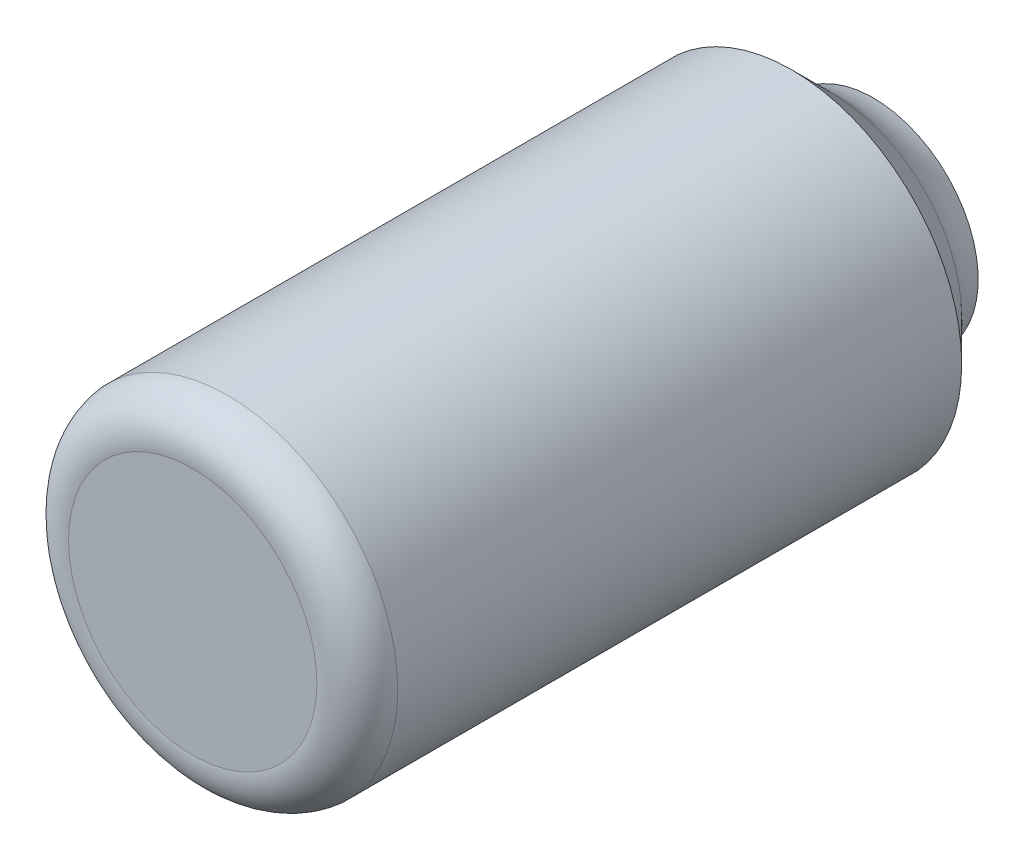
ISO-10303-21;
HEADER;
FILE_DESCRIPTION(('STEP AP214'),'2;1');
FILE_NAME('part.step','',(''),(''),'','','');
FILE_SCHEMA(('AUTOMOTIVE_DESIGN { 1 0 10303 214 1 1 1 1 }'));
ENDSEC;
DATA;
#1=APPLICATION_CONTEXT('core data for automotive mechanical design processes');
#2=APPLICATION_PROTOCOL_DEFINITION('international standard','automotive_design',2000,#1);
#3=PRODUCT_CONTEXT('',#1,'mechanical');
#4=PRODUCT('Part','Part','',(#3));
#5=PRODUCT_RELATED_PRODUCT_CATEGORY('part','',(#4));
#6=PRODUCT_DEFINITION_FORMATION('','',#4);
#7=PRODUCT_DEFINITION_CONTEXT('part definition',#1,'design');
#8=PRODUCT_DEFINITION('design','',#6,#7);
#9=PRODUCT_DEFINITION_SHAPE('','',#8);
#10=(LENGTH_UNIT() NAMED_UNIT(*) SI_UNIT(.MILLI.,.METRE.));
#11=(NAMED_UNIT(*) PLANE_ANGLE_UNIT() SI_UNIT($,.RADIAN.));
#12=(NAMED_UNIT(*) SI_UNIT($,.STERADIAN.) SOLID_ANGLE_UNIT());
#13=UNCERTAINTY_MEASURE_WITH_UNIT(LENGTH_MEASURE(1.E-05),#10,'distance_accuracy_value','');
#14=(GEOMETRIC_REPRESENTATION_CONTEXT(3) GLOBAL_UNCERTAINTY_ASSIGNED_CONTEXT((#13)) GLOBAL_UNIT_ASSIGNED_CONTEXT((#10,
#11,#12)) REPRESENTATION_CONTEXT('',''));
#15=CARTESIAN_POINT('',(0.,0.,0.));
#16=DIRECTION('',(0.,0.,1.));
#17=DIRECTION('',(1.,0.,0.));
#18=AXIS2_PLACEMENT_3D('',#15,#16,#17);
#19=CARTESIAN_POINT('',(47.8355133380434,0.,-140.449159359589));
#20=DIRECTION('',(0.,0.,-1.));
#21=DIRECTION('',(-1.,0.,0.));
#22=AXIS2_PLACEMENT_3D('',#19,#20,#21);
#23=PLANE('',#22);
#24=CARTESIAN_POINT('',(47.8355133380434,0.,-140.449159359589));
#25=DIRECTION('',(0.,0.,-1.));
#26=DIRECTION('',(-1.,0.,0.));
#27=AXIS2_PLACEMENT_3D('',#24,#25,#26);
#28=CIRCLE('',#27,9.6066359257185);
#29=CARTESIAN_POINT('',(38.2288774123249,0.,-140.449159359589));
#30=VERTEX_POINT('',#29);
#31=EDGE_CURVE('E11',#30,#30,#28,.T.);
#32=ORIENTED_EDGE('',*,*,#31,.T.);
#33=EDGE_LOOP('',(#32));
#34=FACE_BOUND('',#33,.T.);
#35=DIRECTION('',(-0.970041850088927,0.242937870814848,0.));
#36=VECTOR('',#35,1.);
#37=CARTESIAN_POINT('',(51.7545287333468,-2.70339492537794,-140.449159359589));
#38=LINE('',#37,#36);
#39=CARTESIAN_POINT('',(52.3415378287659,-2.8504058401926,-140.449159359589));
#40=VERTEX_POINT('',#39);
#41=CARTESIAN_POINT('',(51.7545287333468,-2.70339492537794,-140.449159359589));
#42=VERTEX_POINT('',#41);
#43=EDGE_CURVE('E194',#40,#42,#38,.T.);
#44=ORIENTED_EDGE('',*,*,#43,.F.);
#45=DIRECTION('',(-0.94175387951254,-0.336302884946117,0.));
#46=VECTOR('',#45,1.);
#47=CARTESIAN_POINT('',(52.3415378287659,-2.8504058401926,-140.449159359589));
#48=LINE('',#47,#46);
#49=CARTESIAN_POINT('',(53.2448602592391,-2.52782693076256,-140.449159359589));
#50=VERTEX_POINT('',#49);
#51=EDGE_CURVE('E191',#50,#40,#48,.T.);
#52=ORIENTED_EDGE('',*,*,#51,.F.);
#53=DIRECTION('',(-0.456709986704067,-0.88961564062508,0.));
#54=VECTOR('',#53,1.);
#55=CARTESIAN_POINT('',(53.2448602592391,-2.52782693076256,-140.449159359589));
#56=LINE('',#55,#54);
#57=CARTESIAN_POINT('',(53.9306708570305,-1.19195109694366,-140.449159359589));
#58=VERTEX_POINT('',#57);
#59=EDGE_CURVE('E114',#58,#50,#56,.T.);
#60=ORIENTED_EDGE('',*,*,#59,.F.);
#61=DIRECTION('',(0.,-1.,0.));
#62=VECTOR('',#61,1.);
#63=CARTESIAN_POINT('',(53.9306708570305,-1.19195109694366,-140.449159359589));
#64=LINE('',#63,#62);
#65=CARTESIAN_POINT('',(53.9306708570305,0.,-140.449159359589));
#66=VERTEX_POINT('',#65);
#67=EDGE_CURVE('E224',#66,#58,#64,.T.);
#68=ORIENTED_EDGE('',*,*,#67,.F.);
#69=DIRECTION('',(0.475631900034391,-0.879644414334381,0.));
#70=VECTOR('',#69,1.);
#71=CARTESIAN_POINT('',(53.9306708570305,0.,-140.449159359589));
#72=LINE('',#71,#70);
#73=CARTESIAN_POINT('',(53.3971273301414,0.986747489389014,-140.449159359589));
#74=VERTEX_POINT('',#73);
#75=EDGE_CURVE('E180',#74,#66,#72,.T.);
#76=ORIENTED_EDGE('',*,*,#75,.F.);
#77=DIRECTION('',(1.,0.,0.));
#78=VECTOR('',#77,1.);
#79=CARTESIAN_POINT('',(53.3971273301414,0.986747489389014,-140.449159359589));
#80=LINE('',#79,#78);
#81=CARTESIAN_POINT('',(52.0041654403258,0.986747489389014,-140.449159359589));
#82=VERTEX_POINT('',#81);
#83=EDGE_CURVE('E221',#82,#74,#80,.T.);
#84=ORIENTED_EDGE('',*,*,#83,.F.);
#85=DIRECTION('',(0.994351366702763,-0.106138398029874,0.));
#86=VECTOR('',#85,1.);
#87=CARTESIAN_POINT('',(52.0041654403258,0.986747489389014,-140.449159359589));
#88=LINE('',#87,#86);
#89=CARTESIAN_POINT('',(51.0285729615471,1.09088353857143,-140.449159359589));
#90=VERTEX_POINT('',#89);
#91=EDGE_CURVE('E219',#90,#82,#88,.T.);
#92=ORIENTED_EDGE('',*,*,#91,.F.);
#93=DIRECTION('',(1.,0.,0.));
#94=VECTOR('',#93,1.);
#95=CARTESIAN_POINT('',(51.0285729615471,1.09088353857143,-140.449159359589));
#96=LINE('',#95,#94);
#97=CARTESIAN_POINT('',(48.9586917903262,1.09088353857142,-140.449159359589));
#98=VERTEX_POINT('',#97);
#99=EDGE_CURVE('E217',#98,#90,#96,.T.);
#100=ORIENTED_EDGE('',*,*,#99,.F.);
#101=DIRECTION('',(0.475631900034341,-0.879644414334408,0.));
#102=VECTOR('',#101,1.);
#103=CARTESIAN_POINT('',(48.9586917903262,1.09088353857142,-140.449159359589));
#104=LINE('',#103,#102);
#105=CARTESIAN_POINT('',(48.8720461133404,1.25112801708793,-140.449159359589));
#106=VERTEX_POINT('',#105);
#107=EDGE_CURVE('E215',#106,#98,#104,.T.);
#108=ORIENTED_EDGE('',*,*,#107,.F.);
#109=DIRECTION('',(1.,0.,0.));
#110=VECTOR('',#109,1.);
#111=CARTESIAN_POINT('',(48.8720461133404,1.25112801708793,-140.449159359589));
#112=LINE('',#111,#110);
#113=CARTESIAN_POINT('',(47.8198321558652,1.25112801708791,-140.449159359589));
#114=VERTEX_POINT('',#113);
#115=EDGE_CURVE('E213',#114,#106,#112,.T.);
#116=ORIENTED_EDGE('',*,*,#115,.F.);
#117=DIRECTION('',(0.879644414334501,0.475631900034167,0.));
#118=VECTOR('',#117,1.);
#119=CARTESIAN_POINT('',(47.8198321558652,1.25112801708791,-140.449159359589));
#120=LINE('',#119,#118);
#121=CARTESIAN_POINT('',(47.7468753933748,1.21167961839615,-140.449159359589));
#122=VERTEX_POINT('',#121);
#123=EDGE_CURVE('E211',#122,#114,#120,.T.);
#124=ORIENTED_EDGE('',*,*,#123,.F.);
#125=DIRECTION('',(0.456709986704065,0.889615640625081,0.));
#126=VECTOR('',#125,1.);
#127=CARTESIAN_POINT('',(47.7468753933748,1.21167961839615,-140.449159359589));
#128=LINE('',#127,#126);
#129=CARTESIAN_POINT('',(47.3737815134735,0.484938008524661,-140.449159359589));
#130=VERTEX_POINT('',#129);
#131=EDGE_CURVE('E209',#130,#122,#128,.T.);
#132=ORIENTED_EDGE('',*,*,#131,.F.);
#133=DIRECTION('',(0.242937870814847,0.970041850088927,0.));
#134=VECTOR('',#133,1.);
#135=CARTESIAN_POINT('',(47.3737815134735,0.484938008524661,-140.449159359589));
#136=LINE('',#135,#134);
#137=CARTESIAN_POINT('',(47.166149856795,-0.344127446383171,-140.449159359589));
#138=VERTEX_POINT('',#137);
#139=EDGE_CURVE('E207',#138,#130,#136,.T.);
#140=ORIENTED_EDGE('',*,*,#139,.F.);
#141=DIRECTION('',(0.,1.,0.));
#142=VECTOR('',#141,1.);
#143=CARTESIAN_POINT('',(47.166149856795,-0.344127446383171,-140.449159359589));
#144=LINE('',#143,#142);
#145=CARTESIAN_POINT('',(47.166149856795,-1.08716801066841,-140.449159359589));
#146=VERTEX_POINT('',#145);
#147=EDGE_CURVE('E205',#146,#138,#144,.T.);
#148=ORIENTED_EDGE('',*,*,#147,.F.);
#149=DIRECTION('',(-0.475631900034389,0.879644414334381,0.));
#150=VECTOR('',#149,1.);
#151=CARTESIAN_POINT('',(47.166149856795,-1.08716801066841,-140.449159359589));
#152=LINE('',#151,#150);
#153=CARTESIAN_POINT('',(47.94512750765,-2.52782693076256,-140.449159359589));
#154=VERTEX_POINT('',#153);
#155=EDGE_CURVE('E203',#154,#146,#152,.T.);
#156=ORIENTED_EDGE('',*,*,#155,.F.);
#157=DIRECTION('',(-1.,0.,0.));
#158=VECTOR('',#157,1.);
#159=CARTESIAN_POINT('',(47.94512750765,-2.52782693076256,-140.449159359589));
#160=LINE('',#159,#158);
#161=CARTESIAN_POINT('',(49.9755772487313,-2.52782693076256,-140.449159359589));
#162=VERTEX_POINT('',#161);
#163=EDGE_CURVE('E201',#162,#154,#160,.T.);
#164=ORIENTED_EDGE('',*,*,#163,.F.);
#165=DIRECTION('',(-0.970041850088927,0.242937870814847,0.));
#166=VECTOR('',#165,1.);
#167=CARTESIAN_POINT('',(49.9755772487313,-2.52782693076256,-140.449159359589));
#168=LINE('',#167,#166);
#169=CARTESIAN_POINT('',(50.6766136978525,-2.70339492537794,-140.449159359589));
#170=VERTEX_POINT('',#169);
#171=EDGE_CURVE('E199',#170,#162,#168,.T.);
#172=ORIENTED_EDGE('',*,*,#171,.F.);
#173=DIRECTION('',(-1.,0.,0.));
#174=VECTOR('',#173,1.);
#175=CARTESIAN_POINT('',(50.6766136978525,-2.70339492537794,-140.449159359589));
#176=LINE('',#175,#174);
#177=EDGE_CURVE('E197',#42,#170,#176,.T.);
#178=ORIENTED_EDGE('',*,*,#177,.F.);
#179=EDGE_LOOP('',(#44,#52,#60,#68,#76,#84,#92,#100,#108,#116,#124,#132,#140,#148,#156,#164,
#172,#178));
#180=FACE_BOUND('',#179,.T.);
#181=ADVANCED_FACE('F35',(#34,#180),#23,.T.);
#182=CARTESIAN_POINT('',(47.8355133380434,0.,-141.449159359589));
#183=DIRECTION('',(0.,0.,-1.));
#184=DIRECTION('',(-1.,0.,0.));
#185=AXIS2_PLACEMENT_3D('',#182,#183,#184);
#186=PLANE('',#185);
#187=CARTESIAN_POINT('',(47.8355133380434,0.,-141.449159359589));
#188=DIRECTION('',(0.,0.,-1.));
#189=DIRECTION('',(-1.,0.,0.));
#190=AXIS2_PLACEMENT_3D('',#187,#188,#189);
#191=CIRCLE('',#190,10.6066359257185);
#192=CARTESIAN_POINT('',(37.2288774123249,0.,-141.449159359589));
#193=VERTEX_POINT('',#192);
#194=EDGE_CURVE('E272',#193,#193,#191,.T.);
#195=ORIENTED_EDGE('',*,*,#194,.F.);
#196=EDGE_LOOP('',(#195));
#197=FACE_BOUND('',#196,.T.);
#198=CARTESIAN_POINT('',(47.8355133380434,0.,-141.449159359589));
#199=DIRECTION('',(0.,0.,-1.));
#200=DIRECTION('',(-1.,0.,0.));
#201=AXIS2_PLACEMENT_3D('',#198,#199,#200);
#202=CIRCLE('',#201,11.1551524124221);
#203=CARTESIAN_POINT('',(36.6803609256212,0.,-141.449159359589));
#204=VERTEX_POINT('',#203);
#205=EDGE_CURVE('E284',#204,#204,#202,.T.);
#206=ORIENTED_EDGE('',*,*,#205,.T.);
#207=EDGE_LOOP('',(#206));
#208=FACE_BOUND('',#207,.T.);
#209=ADVANCED_FACE('F298',(#197,#208),#186,.T.);
#210=CARTESIAN_POINT('',(47.8355133380434,0.,-139.695253366882));
#211=DIRECTION('',(0.,0.,1.));
#212=DIRECTION('',(1.,0.,0.));
#213=AXIS2_PLACEMENT_3D('',#210,#211,#212);
#214=CONICAL_SURFACE('',#213,11.1551524124221,0.78539816339744);
#215=CARTESIAN_POINT('',(47.8355133380434,0.,-137.161496517432));
#216=DIRECTION('',(0.,0.,1.));
#217=DIRECTION('',(1.,0.,0.));
#218=AXIS2_PLACEMENT_3D('',#215,#216,#217);
#219=CIRCLE('',#218,13.6889092618714);
#220=CARTESIAN_POINT('',(61.5244225999147,0.,-137.161496517432));
#221=VERTEX_POINT('',#220);
#222=EDGE_CURVE('E43',#221,#221,#219,.T.);
#223=ORIENTED_EDGE('',*,*,#222,.T.);
#224=EDGE_LOOP('',(#223));
#225=FACE_BOUND('',#224,.T.);
#226=CARTESIAN_POINT('',(47.8355133380434,0.,-132.769496790582));
#227=DIRECTION('',(0.,0.,-1.));
#228=DIRECTION('',(-1.,0.,0.));
#229=AXIS2_PLACEMENT_3D('',#226,#227,#228);
#230=CIRCLE('',#229,18.0809089887216);
#231=CARTESIAN_POINT('',(29.7546043493217,0.,-132.769496790582));
#232=VERTEX_POINT('',#231);
#233=EDGE_CURVE('E281',#232,#232,#230,.T.);
#234=ORIENTED_EDGE('',*,*,#233,.T.);
#235=EDGE_LOOP('',(#234));
#236=FACE_BOUND('',#235,.T.);
#237=ADVANCED_FACE('F289',(#225,#236),#214,.T.);
#238=CARTESIAN_POINT('',(47.8355133380434,0.,-141.449159359589));
#239=DIRECTION('',(0.,0.,-1.));
#240=DIRECTION('',(-1.,0.,0.));
#241=AXIS2_PLACEMENT_3D('',#238,#239,#240);
#242=CYLINDRICAL_SURFACE('',#241,18.0809089887216);
#243=CARTESIAN_POINT('',(47.8355133380434,0.,-72.7686964143737));
#244=DIRECTION('',(0.,0.,-1.));
#245=DIRECTION('',(-1.,0.,0.));
#246=AXIS2_PLACEMENT_3D('',#243,#244,#245);
#247=CIRCLE('',#246,18.0809089887216);
#248=CARTESIAN_POINT('',(29.7546043493217,0.,-72.7686964143737));
#249=VERTEX_POINT('',#248);
#250=EDGE_CURVE('E278',#249,#249,#247,.T.);
#251=ORIENTED_EDGE('',*,*,#250,.T.);
#252=EDGE_LOOP('',(#251));
#253=FACE_BOUND('',#252,.T.);
#254=ORIENTED_EDGE('',*,*,#233,.F.);
#255=EDGE_LOOP('',(#254));
#256=FACE_BOUND('',#255,.T.);
#257=ADVANCED_FACE('F306',(#253,#256),#242,.T.);
#258=CARTESIAN_POINT('',(47.8355133380434,0.,-73.3364639487153));
#259=DIRECTION('',(0.,0.,-1.));
#260=DIRECTION('',(-1.,0.,0.));
#261=AXIS2_PLACEMENT_3D('',#258,#259,#260);
#262=TOROIDAL_SURFACE('',#261,13.7791053245254,4.3391099016209);
#263=CARTESIAN_POINT('',(47.8355133380434,0.,-69.034660284519));
#264=DIRECTION('',(0.,0.,-1.));
#265=DIRECTION('',(-1.,0.,0.));
#266=AXIS2_PLACEMENT_3D('',#263,#264,#265);
#267=CIRCLE('',#266,13.2113377901839);
#268=CARTESIAN_POINT('',(34.6241755478595,0.,-69.034660284519));
#269=VERTEX_POINT('',#268);
#270=EDGE_CURVE('E275',#269,#269,#267,.T.);
#271=ORIENTED_EDGE('',*,*,#270,.T.);
#272=EDGE_LOOP('',(#271));
#273=FACE_BOUND('',#272,.T.);
#274=ORIENTED_EDGE('',*,*,#250,.F.);
#275=EDGE_LOOP('',(#274));
#276=FACE_BOUND('',#275,.T.);
#277=ADVANCED_FACE('F314',(#273,#276),#262,.T.);
#278=CARTESIAN_POINT('',(34.6241755478595,0.,-69.034660284519));
#279=DIRECTION('',(0.,0.,1.));
#280=DIRECTION('',(1.,0.,0.));
#281=AXIS2_PLACEMENT_3D('',#278,#279,#280);
#282=PLANE('',#281);
#283=ORIENTED_EDGE('',*,*,#270,.F.);
#284=EDGE_LOOP('',(#283));
#285=FACE_BOUND('',#284,.T.);
#286=ADVANCED_FACE('F295',(#285),#282,.T.);
#287=CARTESIAN_POINT('',(47.8355133380434,0.,-144.232564329298));
#288=DIRECTION('',(0.,0.,-1.));
#289=DIRECTION('',(-1.,0.,0.));
#290=AXIS2_PLACEMENT_3D('',#287,#288,#289);
#291=TOROIDAL_SURFACE('',#290,20.7599770737369,10.);
#292=ORIENTED_EDGE('',*,*,#222,.F.);
#293=EDGE_LOOP('',(#292));
#294=FACE_BOUND('',#293,.T.);
#295=ORIENTED_EDGE('',*,*,#205,.F.);
#296=EDGE_LOOP('',(#295));
#297=FACE_BOUND('',#296,.T.);
#298=ADVANCED_FACE('F292',(#294,#297),#291,.F.);
#299=CARTESIAN_POINT('',(47.8355133380434,0.,-141.449159359589));
#300=DIRECTION('',(0.,0.,-1.));
#301=DIRECTION('',(-1.,0.,0.));
#302=AXIS2_PLACEMENT_3D('',#299,#300,#301);
#303=TOROIDAL_SURFACE('',#302,9.6066359257185,1.);
#304=ORIENTED_EDGE('',*,*,#194,.T.);
#305=EDGE_LOOP('',(#304));
#306=FACE_BOUND('',#305,.T.);
#307=ORIENTED_EDGE('',*,*,#31,.F.);
#308=EDGE_LOOP('',(#307));
#309=FACE_BOUND('',#308,.T.);
#310=ADVANCED_FACE('F37',(#306,#309),#303,.F.);
#311=CARTESIAN_POINT('',(52.3415378287659,-2.8504058401926,-141.449159359589));
#312=DIRECTION('',(-0.336302884946117,0.94175387951254,0.));
#313=DIRECTION('',(-0.94175387951254,-0.336302884946117,0.));
#314=AXIS2_PLACEMENT_3D('',#311,#312,#313);
#315=PLANE('',#314);
#316=ORIENTED_EDGE('',*,*,#51,.T.);
#317=DIRECTION('',(0.,0.,1.));
#318=VECTOR('',#317,1.);
#319=CARTESIAN_POINT('',(52.3415378287659,-2.8504058401926,-141.449159359589));
#320=LINE('',#319,#318);
#321=CARTESIAN_POINT('',(52.3415378287659,-2.8504058401926,-141.449159359589));
#322=VERTEX_POINT('',#321);
#323=EDGE_CURVE('E270',#322,#40,#320,.T.);
#324=ORIENTED_EDGE('',*,*,#323,.F.);
#325=DIRECTION('',(-0.94175387951254,-0.336302884946117,0.));
#326=VECTOR('',#325,1.);
#327=CARTESIAN_POINT('',(52.3415378287659,-2.8504058401926,-141.449159359589));
#328=LINE('',#327,#326);
#329=CARTESIAN_POINT('',(53.2448602592391,-2.52782693076256,-141.449159359589));
#330=VERTEX_POINT('',#329);
#331=EDGE_CURVE('E227',#330,#322,#328,.T.);
#332=ORIENTED_EDGE('',*,*,#331,.F.);
#333=DIRECTION('',(0.,0.,1.));
#334=VECTOR('',#333,1.);
#335=CARTESIAN_POINT('',(53.2448602592391,-2.52782693076256,-141.449159359589));
#336=LINE('',#335,#334);
#337=EDGE_CURVE('E187',#330,#50,#336,.T.);
#338=ORIENTED_EDGE('',*,*,#337,.T.);
#339=EDGE_LOOP('',(#316,#324,#332,#338));
#340=FACE_BOUND('',#339,.T.);
#341=ADVANCED_FACE('F322',(#340),#315,.F.);
#342=CARTESIAN_POINT('',(51.7545287333468,-2.70339492537794,-141.449159359589));
#343=DIRECTION('',(0.242937870814848,0.970041850088927,0.));
#344=DIRECTION('',(-0.970041850088927,0.242937870814848,0.));
#345=AXIS2_PLACEMENT_3D('',#342,#343,#344);
#346=PLANE('',#345);
#347=ORIENTED_EDGE('',*,*,#43,.T.);
#348=DIRECTION('',(0.,0.,1.));
#349=VECTOR('',#348,1.);
#350=CARTESIAN_POINT('',(51.7545287333468,-2.70339492537794,-141.449159359589));
#351=LINE('',#350,#349);
#352=CARTESIAN_POINT('',(51.7545287333468,-2.70339492537794,-141.449159359589));
#353=VERTEX_POINT('',#352);
#354=EDGE_CURVE('E267',#353,#42,#351,.T.);
#355=ORIENTED_EDGE('',*,*,#354,.F.);
#356=DIRECTION('',(-0.970041850088927,0.242937870814848,0.));
#357=VECTOR('',#356,1.);
#358=CARTESIAN_POINT('',(51.7545287333468,-2.70339492537794,-141.449159359589));
#359=LINE('',#358,#357);
#360=EDGE_CURVE('E122',#322,#353,#359,.T.);
#361=ORIENTED_EDGE('',*,*,#360,.F.);
#362=ORIENTED_EDGE('',*,*,#323,.T.);
#363=EDGE_LOOP('',(#347,#355,#361,#362));
#364=FACE_BOUND('',#363,.T.);
#365=ADVANCED_FACE('F325',(#364),#346,.F.);
#366=CARTESIAN_POINT('',(50.6766136978525,-2.70339492537794,-141.449159359589));
#367=DIRECTION('',(0.,1.,0.));
#368=DIRECTION('',(-1.,0.,0.));
#369=AXIS2_PLACEMENT_3D('',#366,#367,#368);
#370=PLANE('',#369);
#371=ORIENTED_EDGE('',*,*,#177,.T.);
#372=DIRECTION('',(0.,0.,1.));
#373=VECTOR('',#372,1.);
#374=CARTESIAN_POINT('',(50.6766136978525,-2.70339492537794,-141.449159359589));
#375=LINE('',#374,#373);
#376=CARTESIAN_POINT('',(50.6766136978525,-2.70339492537794,-141.449159359589));
#377=VERTEX_POINT('',#376);
#378=EDGE_CURVE('E264',#377,#170,#375,.T.);
#379=ORIENTED_EDGE('',*,*,#378,.F.);
#380=DIRECTION('',(-1.,0.,0.));
#381=VECTOR('',#380,1.);
#382=CARTESIAN_POINT('',(50.6766136978525,-2.70339492537794,-141.449159359589));
#383=LINE('',#382,#381);
#384=EDGE_CURVE('E409',#353,#377,#383,.T.);
#385=ORIENTED_EDGE('',*,*,#384,.F.);
#386=ORIENTED_EDGE('',*,*,#354,.T.);
#387=EDGE_LOOP('',(#371,#379,#385,#386));
#388=FACE_BOUND('',#387,.T.);
#389=ADVANCED_FACE('F329',(#388),#370,.F.);
#390=CARTESIAN_POINT('',(49.9755772487313,-2.52782693076256,-141.449159359589));
#391=DIRECTION('',(0.242937870814847,0.970041850088927,0.));
#392=DIRECTION('',(-0.970041850088927,0.242937870814847,0.));
#393=AXIS2_PLACEMENT_3D('',#390,#391,#392);
#394=PLANE('',#393);
#395=ORIENTED_EDGE('',*,*,#171,.T.);
#396=DIRECTION('',(0.,0.,1.));
#397=VECTOR('',#396,1.);
#398=CARTESIAN_POINT('',(49.9755772487313,-2.52782693076256,-141.449159359589));
#399=LINE('',#398,#397);
#400=CARTESIAN_POINT('',(49.9755772487313,-2.52782693076256,-141.449159359589));
#401=VERTEX_POINT('',#400);
#402=EDGE_CURVE('E261',#401,#162,#399,.T.);
#403=ORIENTED_EDGE('',*,*,#402,.F.);
#404=DIRECTION('',(-0.970041850088927,0.242937870814847,0.));
#405=VECTOR('',#404,1.);
#406=CARTESIAN_POINT('',(49.9755772487313,-2.52782693076256,-141.449159359589));
#407=LINE('',#406,#405);
#408=EDGE_CURVE('E411',#377,#401,#407,.T.);
#409=ORIENTED_EDGE('',*,*,#408,.F.);
#410=ORIENTED_EDGE('',*,*,#378,.T.);
#411=EDGE_LOOP('',(#395,#403,#409,#410));
#412=FACE_BOUND('',#411,.T.);
#413=ADVANCED_FACE('F332',(#412),#394,.F.);
#414=CARTESIAN_POINT('',(47.94512750765,-2.52782693076256,-141.449159359589));
#415=DIRECTION('',(0.,1.,0.));
#416=DIRECTION('',(-1.,0.,0.));
#417=AXIS2_PLACEMENT_3D('',#414,#415,#416);
#418=PLANE('',#417);
#419=ORIENTED_EDGE('',*,*,#163,.T.);
#420=DIRECTION('',(0.,0.,1.));
#421=VECTOR('',#420,1.);
#422=CARTESIAN_POINT('',(47.94512750765,-2.52782693076256,-141.449159359589));
#423=LINE('',#422,#421);
#424=CARTESIAN_POINT('',(47.94512750765,-2.52782693076256,-141.449159359589));
#425=VERTEX_POINT('',#424);
#426=EDGE_CURVE('E258',#425,#154,#423,.T.);
#427=ORIENTED_EDGE('',*,*,#426,.F.);
#428=DIRECTION('',(-1.,0.,0.));
#429=VECTOR('',#428,1.);
#430=CARTESIAN_POINT('',(49.1103870997625,-2.52782693076256,-141.449159359589));
#431=LINE('',#430,#429);
#432=EDGE_CURVE('E413',#401,#425,#431,.T.);
#433=ORIENTED_EDGE('',*,*,#432,.F.);
#434=ORIENTED_EDGE('',*,*,#402,.T.);
#435=EDGE_LOOP('',(#419,#427,#433,#434));
#436=FACE_BOUND('',#435,.T.);
#437=ADVANCED_FACE('F336',(#436),#418,.F.);
#438=CARTESIAN_POINT('',(47.166149856795,-1.08716801066841,-141.449159359589));
#439=DIRECTION('',(0.879644414334381,0.475631900034389,0.));
#440=DIRECTION('',(-0.475631900034389,0.879644414334381,0.));
#441=AXIS2_PLACEMENT_3D('',#438,#439,#440);
#442=PLANE('',#441);
#443=ORIENTED_EDGE('',*,*,#155,.T.);
#444=DIRECTION('',(0.,0.,1.));
#445=VECTOR('',#444,1.);
#446=CARTESIAN_POINT('',(47.166149856795,-1.08716801066841,-141.449159359589));
#447=LINE('',#446,#445);
#448=CARTESIAN_POINT('',(47.166149856795,-1.08716801066841,-141.449159359589));
#449=VERTEX_POINT('',#448);
#450=EDGE_CURVE('E255',#449,#146,#447,.T.);
#451=ORIENTED_EDGE('',*,*,#450,.F.);
#452=DIRECTION('',(-0.475631900034394,0.879644414334379,0.));
#453=VECTOR('',#452,1.);
#454=CARTESIAN_POINT('',(47.5603284534242,-1.8161708398519,-141.449159359589));
#455=LINE('',#454,#453);
#456=EDGE_CURVE('E415',#425,#449,#455,.T.);
#457=ORIENTED_EDGE('',*,*,#456,.F.);
#458=ORIENTED_EDGE('',*,*,#426,.T.);
#459=EDGE_LOOP('',(#443,#451,#457,#458));
#460=FACE_BOUND('',#459,.T.);
#461=ADVANCED_FACE('F340',(#460),#442,.F.);
#462=CARTESIAN_POINT('',(47.166149856795,-0.344127446383171,-141.449159359589));
#463=DIRECTION('',(1.,0.,0.));
#464=DIRECTION('',(0.,1.,0.));
#465=AXIS2_PLACEMENT_3D('',#462,#463,#464);
#466=PLANE('',#465);
#467=ORIENTED_EDGE('',*,*,#147,.T.);
#468=DIRECTION('',(0.,0.,1.));
#469=VECTOR('',#468,1.);
#470=CARTESIAN_POINT('',(47.166149856795,-0.344127446383171,-141.449159359589));
#471=LINE('',#470,#469);
#472=CARTESIAN_POINT('',(47.166149856795,-0.344127446383171,-141.449159359589));
#473=VERTEX_POINT('',#472);
#474=EDGE_CURVE('E252',#473,#138,#471,.T.);
#475=ORIENTED_EDGE('',*,*,#474,.F.);
#476=DIRECTION('',(0.,1.,0.));
#477=VECTOR('',#476,1.);
#478=CARTESIAN_POINT('',(47.166149856795,-0.344127446383171,-141.449159359589));
#479=LINE('',#478,#477);
#480=EDGE_CURVE('E417',#449,#473,#479,.T.);
#481=ORIENTED_EDGE('',*,*,#480,.F.);
#482=ORIENTED_EDGE('',*,*,#450,.T.);
#483=EDGE_LOOP('',(#467,#475,#481,#482));
#484=FACE_BOUND('',#483,.T.);
#485=ADVANCED_FACE('F344',(#484),#466,.F.);
#486=CARTESIAN_POINT('',(47.3737815134735,0.484938008524661,-141.449159359589));
#487=DIRECTION('',(0.970041850088927,-0.242937870814846,0.));
#488=DIRECTION('',(0.242937870814847,0.970041850088927,0.));
#489=AXIS2_PLACEMENT_3D('',#486,#487,#488);
#490=PLANE('',#489);
#491=ORIENTED_EDGE('',*,*,#139,.T.);
#492=DIRECTION('',(0.,0.,1.));
#493=VECTOR('',#492,1.);
#494=CARTESIAN_POINT('',(47.3737815134735,0.484938008524661,-141.449159359589));
#495=LINE('',#494,#493);
#496=CARTESIAN_POINT('',(47.3737815134735,0.484938008524661,-141.449159359589));
#497=VERTEX_POINT('',#496);
#498=EDGE_CURVE('E249',#497,#130,#495,.T.);
#499=ORIENTED_EDGE('',*,*,#498,.F.);
#500=DIRECTION('',(0.242937870814847,0.970041850088927,0.));
#501=VECTOR('',#500,1.);
#502=CARTESIAN_POINT('',(47.3737815134735,0.484938008524661,-141.449159359589));
#503=LINE('',#502,#501);
#504=EDGE_CURVE('E419',#473,#497,#503,.T.);
#505=ORIENTED_EDGE('',*,*,#504,.F.);
#506=ORIENTED_EDGE('',*,*,#474,.T.);
#507=EDGE_LOOP('',(#491,#499,#505,#506));
#508=FACE_BOUND('',#507,.T.);
#509=ADVANCED_FACE('F348',(#508),#490,.F.);
#510=CARTESIAN_POINT('',(47.7468753933748,1.21167961839615,-141.449159359589));
#511=DIRECTION('',(0.889615640625081,-0.456709986704065,0.));
#512=DIRECTION('',(0.456709986704065,0.889615640625081,0.));
#513=AXIS2_PLACEMENT_3D('',#510,#511,#512);
#514=PLANE('',#513);
#515=ORIENTED_EDGE('',*,*,#131,.T.);
#516=DIRECTION('',(0.,0.,1.));
#517=VECTOR('',#516,1.);
#518=CARTESIAN_POINT('',(47.7468753933748,1.21167961839615,-141.449159359589));
#519=LINE('',#518,#517);
#520=CARTESIAN_POINT('',(47.7468753933748,1.21167961839615,-141.449159359589));
#521=VERTEX_POINT('',#520);
#522=EDGE_CURVE('E246',#521,#122,#519,.T.);
#523=ORIENTED_EDGE('',*,*,#522,.F.);
#524=DIRECTION('',(0.456709986704065,0.889615640625081,0.));
#525=VECTOR('',#524,1.);
#526=CARTESIAN_POINT('',(47.7468753933748,1.21167961839615,-141.449159359589));
#527=LINE('',#526,#525);
#528=EDGE_CURVE('E421',#497,#521,#527,.T.);
#529=ORIENTED_EDGE('',*,*,#528,.F.);
#530=ORIENTED_EDGE('',*,*,#498,.T.);
#531=EDGE_LOOP('',(#515,#523,#529,#530));
#532=FACE_BOUND('',#531,.T.);
#533=ADVANCED_FACE('F352',(#532),#514,.F.);
#534=CARTESIAN_POINT('',(47.8198321558652,1.25112801708791,-141.449159359589));
#535=DIRECTION('',(0.475631900034167,-0.879644414334501,0.));
#536=DIRECTION('',(0.879644414334502,0.475631900034167,0.));
#537=AXIS2_PLACEMENT_3D('',#534,#535,#536);
#538=PLANE('',#537);
#539=ORIENTED_EDGE('',*,*,#123,.T.);
#540=DIRECTION('',(0.,0.,1.));
#541=VECTOR('',#540,1.);
#542=CARTESIAN_POINT('',(47.8198321558652,1.25112801708791,-141.449159359589));
#543=LINE('',#542,#541);
#544=CARTESIAN_POINT('',(47.8198321558652,1.25112801708791,-141.449159359589));
#545=VERTEX_POINT('',#544);
#546=EDGE_CURVE('E243',#545,#114,#543,.T.);
#547=ORIENTED_EDGE('',*,*,#546,.F.);
#548=DIRECTION('',(0.879644414334501,0.475631900034167,0.));
#549=VECTOR('',#548,1.);
#550=CARTESIAN_POINT('',(47.8198321558652,1.25112801708791,-141.449159359589));
#551=LINE('',#550,#549);
#552=EDGE_CURVE('E423',#521,#545,#551,.T.);
#553=ORIENTED_EDGE('',*,*,#552,.F.);
#554=ORIENTED_EDGE('',*,*,#522,.T.);
#555=EDGE_LOOP('',(#539,#547,#553,#554));
#556=FACE_BOUND('',#555,.T.);
#557=ADVANCED_FACE('F356',(#556),#538,.F.);
#558=CARTESIAN_POINT('',(48.8720461133404,1.25112801708793,-141.449159359589));
#559=DIRECTION('',(0.,-1.,0.));
#560=DIRECTION('',(1.,0.,0.));
#561=AXIS2_PLACEMENT_3D('',#558,#559,#560);
#562=PLANE('',#561);
#563=ORIENTED_EDGE('',*,*,#115,.T.);
#564=DIRECTION('',(0.,0.,1.));
#565=VECTOR('',#564,1.);
#566=CARTESIAN_POINT('',(48.8720461133404,1.25112801708793,-141.449159359589));
#567=LINE('',#566,#565);
#568=CARTESIAN_POINT('',(48.8720461133404,1.25112801708793,-141.449159359589));
#569=VERTEX_POINT('',#568);
#570=EDGE_CURVE('E240',#569,#106,#567,.T.);
#571=ORIENTED_EDGE('',*,*,#570,.F.);
#572=DIRECTION('',(1.,0.,0.));
#573=VECTOR('',#572,1.);
#574=CARTESIAN_POINT('',(48.8720461133404,1.25112801708793,-141.449159359589));
#575=LINE('',#574,#573);
#576=EDGE_CURVE('E425',#545,#569,#575,.T.);
#577=ORIENTED_EDGE('',*,*,#576,.F.);
#578=ORIENTED_EDGE('',*,*,#546,.T.);
#579=EDGE_LOOP('',(#563,#571,#577,#578));
#580=FACE_BOUND('',#579,.T.);
#581=ADVANCED_FACE('F360',(#580),#562,.F.);
#582=CARTESIAN_POINT('',(48.9586917903262,1.09088353857142,-141.449159359589));
#583=DIRECTION('',(-0.879644414334407,-0.475631900034341,0.));
#584=DIRECTION('',(0.475631900034341,-0.879644414334408,0.));
#585=AXIS2_PLACEMENT_3D('',#582,#583,#584);
#586=PLANE('',#585);
#587=ORIENTED_EDGE('',*,*,#107,.T.);
#588=DIRECTION('',(0.,0.,1.));
#589=VECTOR('',#588,1.);
#590=CARTESIAN_POINT('',(48.9586917903262,1.09088353857142,-141.449159359589));
#591=LINE('',#590,#589);
#592=CARTESIAN_POINT('',(48.9586917903262,1.09088353857142,-141.449159359589));
#593=VERTEX_POINT('',#592);
#594=EDGE_CURVE('E237',#593,#98,#591,.T.);
#595=ORIENTED_EDGE('',*,*,#594,.F.);
#596=DIRECTION('',(0.475631900034341,-0.879644414334408,0.));
#597=VECTOR('',#596,1.);
#598=CARTESIAN_POINT('',(48.9586917903262,1.09088353857142,-141.449159359589));
#599=LINE('',#598,#597);
#600=EDGE_CURVE('E427',#569,#593,#599,.T.);
#601=ORIENTED_EDGE('',*,*,#600,.F.);
#602=ORIENTED_EDGE('',*,*,#570,.T.);
#603=EDGE_LOOP('',(#587,#595,#601,#602));
#604=FACE_BOUND('',#603,.T.);
#605=ADVANCED_FACE('F364',(#604),#586,.F.);
#606=CARTESIAN_POINT('',(51.0285729615471,1.09088353857143,-141.449159359589));
#607=DIRECTION('',(0.,-1.,0.));
#608=DIRECTION('',(0.,0.,-1.));
#609=AXIS2_PLACEMENT_3D('',#606,#607,#608);
#610=PLANE('',#609);
#611=ORIENTED_EDGE('',*,*,#99,.T.);
#612=DIRECTION('',(0.,0.,1.));
#613=VECTOR('',#612,1.);
#614=CARTESIAN_POINT('',(51.0285729615471,1.09088353857143,-141.449159359589));
#615=LINE('',#614,#613);
#616=CARTESIAN_POINT('',(51.0285729615471,1.09088353857143,-141.449159359589));
#617=VERTEX_POINT('',#616);
#618=EDGE_CURVE('E234',#617,#90,#615,.T.);
#619=ORIENTED_EDGE('',*,*,#618,.F.);
#620=DIRECTION('',(1.,0.,0.));
#621=VECTOR('',#620,1.);
#622=CARTESIAN_POINT('',(49.9755772487313,1.09088353857143,-141.449159359589));
#623=LINE('',#622,#621);
#624=EDGE_CURVE('E429',#593,#617,#623,.T.);
#625=ORIENTED_EDGE('',*,*,#624,.F.);
#626=ORIENTED_EDGE('',*,*,#594,.T.);
#627=EDGE_LOOP('',(#611,#619,#625,#626));
#628=FACE_BOUND('',#627,.T.);
#629=ADVANCED_FACE('F368',(#628),#610,.F.);
#630=CARTESIAN_POINT('',(52.0041654403258,0.986747489389014,-141.449159359589));
#631=DIRECTION('',(-0.106138398029874,-0.994351366702763,0.));
#632=DIRECTION('',(0.994351366702763,-0.106138398029874,0.));
#633=AXIS2_PLACEMENT_3D('',#630,#631,#632);
#634=PLANE('',#633);
#635=ORIENTED_EDGE('',*,*,#91,.T.);
#636=DIRECTION('',(0.,0.,1.));
#637=VECTOR('',#636,1.);
#638=CARTESIAN_POINT('',(52.0041654403258,0.986747489389014,-141.449159359589));
#639=LINE('',#638,#637);
#640=CARTESIAN_POINT('',(52.0041654403258,0.986747489389014,-141.449159359589));
#641=VERTEX_POINT('',#640);
#642=EDGE_CURVE('E231',#641,#82,#639,.T.);
#643=ORIENTED_EDGE('',*,*,#642,.F.);
#644=DIRECTION('',(0.994351366702763,-0.106138398029874,0.));
#645=VECTOR('',#644,1.);
#646=CARTESIAN_POINT('',(52.0041654403258,0.986747489389014,-141.449159359589));
#647=LINE('',#646,#645);
#648=EDGE_CURVE('E431',#617,#641,#647,.T.);
#649=ORIENTED_EDGE('',*,*,#648,.F.);
#650=ORIENTED_EDGE('',*,*,#618,.T.);
#651=EDGE_LOOP('',(#635,#643,#649,#650));
#652=FACE_BOUND('',#651,.T.);
#653=ADVANCED_FACE('F372',(#652),#634,.F.);
#654=CARTESIAN_POINT('',(53.3971273301414,0.986747489389014,-141.449159359589));
#655=DIRECTION('',(0.,-1.,0.));
#656=DIRECTION('',(0.,0.,-1.));
#657=AXIS2_PLACEMENT_3D('',#654,#655,#656);
#658=PLANE('',#657);
#659=ORIENTED_EDGE('',*,*,#83,.T.);
#660=DIRECTION('',(0.,0.,1.));
#661=VECTOR('',#660,1.);
#662=CARTESIAN_POINT('',(53.3971273301414,0.986747489389014,-141.449159359589));
#663=LINE('',#662,#661);
#664=CARTESIAN_POINT('',(53.3971273301414,0.986747489389014,-141.449159359589));
#665=VERTEX_POINT('',#664);
#666=EDGE_CURVE('E183',#665,#74,#663,.T.);
#667=ORIENTED_EDGE('',*,*,#666,.F.);
#668=DIRECTION('',(1.,0.,0.));
#669=VECTOR('',#668,1.);
#670=CARTESIAN_POINT('',(52.7269378370543,0.986747489389014,-141.449159359589));
#671=LINE('',#670,#669);
#672=EDGE_CURVE('E171',#641,#665,#671,.T.);
#673=ORIENTED_EDGE('',*,*,#672,.F.);
#674=ORIENTED_EDGE('',*,*,#642,.T.);
#675=EDGE_LOOP('',(#659,#667,#673,#674));
#676=FACE_BOUND('',#675,.T.);
#677=ADVANCED_FACE('F376',(#676),#658,.F.);
#678=CARTESIAN_POINT('',(53.9306708570305,0.,-141.449159359589));
#679=DIRECTION('',(-0.879644414334381,-0.475631900034391,0.));
#680=DIRECTION('',(0.475631900034391,-0.879644414334381,0.));
#681=AXIS2_PLACEMENT_3D('',#678,#679,#680);
#682=PLANE('',#681);
#683=ORIENTED_EDGE('',*,*,#75,.T.);
#684=DIRECTION('',(0.,0.,1.));
#685=VECTOR('',#684,1.);
#686=CARTESIAN_POINT('',(53.9306708570305,0.,-141.449159359589));
#687=LINE('',#686,#685);
#688=CARTESIAN_POINT('',(53.9306708570305,0.,-141.449159359589));
#689=VERTEX_POINT('',#688);
#690=EDGE_CURVE('E177',#689,#66,#687,.T.);
#691=ORIENTED_EDGE('',*,*,#690,.F.);
#692=DIRECTION('',(0.475631900034391,-0.879644414334381,0.));
#693=VECTOR('',#692,1.);
#694=CARTESIAN_POINT('',(53.9306708570305,0.,-141.449159359589));
#695=LINE('',#694,#693);
#696=EDGE_CURVE('E165',#665,#689,#695,.T.);
#697=ORIENTED_EDGE('',*,*,#696,.F.);
#698=ORIENTED_EDGE('',*,*,#666,.T.);
#699=EDGE_LOOP('',(#683,#691,#697,#698));
#700=FACE_BOUND('',#699,.T.);
#701=ADVANCED_FACE('F178',(#700),#682,.F.);
#702=CARTESIAN_POINT('',(53.9306708570305,-1.19195109694366,-141.449159359589));
#703=DIRECTION('',(-1.,0.,0.));
#704=DIRECTION('',(0.,0.,1.));
#705=AXIS2_PLACEMENT_3D('',#702,#703,#704);
#706=PLANE('',#705);
#707=ORIENTED_EDGE('',*,*,#67,.T.);
#708=DIRECTION('',(0.,0.,1.));
#709=VECTOR('',#708,1.);
#710=CARTESIAN_POINT('',(53.9306708570305,-1.19195109694366,-141.449159359589));
#711=LINE('',#710,#709);
#712=CARTESIAN_POINT('',(53.9306708570305,-1.19195109694366,-141.449159359589));
#713=VERTEX_POINT('',#712);
#714=EDGE_CURVE('E50',#713,#58,#711,.T.);
#715=ORIENTED_EDGE('',*,*,#714,.F.);
#716=DIRECTION('',(0.,-1.,0.));
#717=VECTOR('',#716,1.);
#718=CARTESIAN_POINT('',(53.9306708570305,-1.19195109694366,-141.449159359589));
#719=LINE('',#718,#717);
#720=EDGE_CURVE('E169',#689,#713,#719,.T.);
#721=ORIENTED_EDGE('',*,*,#720,.F.);
#722=ORIENTED_EDGE('',*,*,#690,.T.);
#723=EDGE_LOOP('',(#707,#715,#721,#722));
#724=FACE_BOUND('',#723,.T.);
#725=ADVANCED_FACE('F185',(#724),#706,.F.);
#726=CARTESIAN_POINT('',(53.2448602592391,-2.52782693076256,-141.449159359589));
#727=DIRECTION('',(-0.88961564062508,0.456709986704067,0.));
#728=DIRECTION('',(-0.456709986704067,-0.88961564062508,0.));
#729=AXIS2_PLACEMENT_3D('',#726,#727,#728);
#730=PLANE('',#729);
#731=ORIENTED_EDGE('',*,*,#59,.T.);
#732=ORIENTED_EDGE('',*,*,#337,.F.);
#733=DIRECTION('',(-0.456709986704067,-0.88961564062508,0.));
#734=VECTOR('',#733,1.);
#735=CARTESIAN_POINT('',(53.2448602592391,-2.52782693076256,-141.449159359589));
#736=LINE('',#735,#734);
#737=EDGE_CURVE('E58',#713,#330,#736,.T.);
#738=ORIENTED_EDGE('',*,*,#737,.F.);
#739=ORIENTED_EDGE('',*,*,#714,.T.);
#740=EDGE_LOOP('',(#731,#732,#738,#739));
#741=FACE_BOUND('',#740,.T.);
#742=ADVANCED_FACE('F385',(#741),#730,.F.);
#743=CARTESIAN_POINT('',(0.,0.,-141.449159359589));
#744=DIRECTION('',(0.,0.,1.));
#745=DIRECTION('',(1.,0.,0.));
#746=AXIS2_PLACEMENT_3D('',#743,#744,#745);
#747=PLANE('',#746);
#748=CARTESIAN_POINT('',(51.6152763471856,-0.969807614187567,-141.449159359589));
#749=DIRECTION('',(0.,0.,-1.));
#750=DIRECTION('',(-1.,0.,0.));
#751=AXIS2_PLACEMENT_3D('',#748,#749,#750);
#752=CIRCLE('',#751,1.35746648068365);
#753=CARTESIAN_POINT('',(50.2578098665019,-0.969807614187567,-141.449159359589));
#754=VERTEX_POINT('',#753);
#755=EDGE_CURVE('E402',#754,#754,#752,.T.);
#756=ORIENTED_EDGE('',*,*,#755,.F.);
#757=EDGE_LOOP('',(#756));
#758=FACE_BOUND('',#757,.T.);
#759=ORIENTED_EDGE('',*,*,#331,.T.);
#760=ORIENTED_EDGE('',*,*,#360,.T.);
#761=ORIENTED_EDGE('',*,*,#384,.T.);
#762=ORIENTED_EDGE('',*,*,#408,.T.);
#763=ORIENTED_EDGE('',*,*,#432,.T.);
#764=ORIENTED_EDGE('',*,*,#456,.T.);
#765=ORIENTED_EDGE('',*,*,#480,.T.);
#766=ORIENTED_EDGE('',*,*,#504,.T.);
#767=ORIENTED_EDGE('',*,*,#528,.T.);
#768=ORIENTED_EDGE('',*,*,#552,.T.);
#769=ORIENTED_EDGE('',*,*,#576,.T.);
#770=ORIENTED_EDGE('',*,*,#600,.T.);
#771=ORIENTED_EDGE('',*,*,#624,.T.);
#772=ORIENTED_EDGE('',*,*,#648,.T.);
#773=ORIENTED_EDGE('',*,*,#672,.T.);
#774=ORIENTED_EDGE('',*,*,#696,.T.);
#775=ORIENTED_EDGE('',*,*,#720,.T.);
#776=ORIENTED_EDGE('',*,*,#737,.T.);
#777=EDGE_LOOP('',(#759,#760,#761,#762,#763,#764,#765,#766,#767,#768,#769,#770,#771,#772,#773,
#774,#775,#776));
#778=FACE_BOUND('',#777,.T.);
#779=ADVANCED_FACE('F167',(#758,#778),#747,.F.);
#780=CARTESIAN_POINT('',(51.6152763471856,-0.969807614187567,-140.449159359589));
#781=DIRECTION('',(0.,0.,-1.));
#782=DIRECTION('',(-1.,0.,0.));
#783=AXIS2_PLACEMENT_3D('',#780,#781,#782);
#784=CYLINDRICAL_SURFACE('',#783,1.35746648068365);
#785=CARTESIAN_POINT('',(51.6152763471856,-0.969807614187567,-140.449159359589));
#786=DIRECTION('',(0.,0.,-1.));
#787=DIRECTION('',(-1.,0.,0.));
#788=AXIS2_PLACEMENT_3D('',#785,#786,#787);
#789=CIRCLE('',#788,1.35746648068365);
#790=CARTESIAN_POINT('',(50.2578098665019,-0.969807614187567,-140.449159359589));
#791=VERTEX_POINT('',#790);
#792=EDGE_CURVE('E195',#791,#791,#789,.T.);
#793=ORIENTED_EDGE('',*,*,#792,.F.);
#794=EDGE_LOOP('',(#793));
#795=FACE_BOUND('',#794,.T.);
#796=ORIENTED_EDGE('',*,*,#755,.T.);
#797=EDGE_LOOP('',(#796));
#798=FACE_BOUND('',#797,.T.);
#799=ADVANCED_FACE('F390',(#795,#798),#784,.F.);
#800=CARTESIAN_POINT('',(51.6152763471856,-0.969807614187567,-140.449159359589));
#801=DIRECTION('',(0.,0.,-1.));
#802=DIRECTION('',(-1.,0.,0.));
#803=AXIS2_PLACEMENT_3D('',#800,#801,#802);
#804=PLANE('',#803);
#805=ORIENTED_EDGE('',*,*,#792,.T.);
#806=EDGE_LOOP('',(#805));
#807=FACE_BOUND('',#806,.T.);
#808=ADVANCED_FACE('F394',(#807),#804,.T.);
#809=CLOSED_SHELL('',(#181,#209,#237,#257,#277,#286,#298,#310,#341,#365,#389,#413,#437,#461,
#485,#509,#533,#557,#581,#605,#629,#653,#677,#701,#725,#742,#779,#799,#808));
#810=MANIFOLD_SOLID_BREP('B2',#809);
#811=ADVANCED_BREP_SHAPE_REPRESENTATION('',(#18,#810),#14);
#812=SHAPE_DEFINITION_REPRESENTATION(#9,#811);
ENDSEC;
END-ISO-10303-21;
